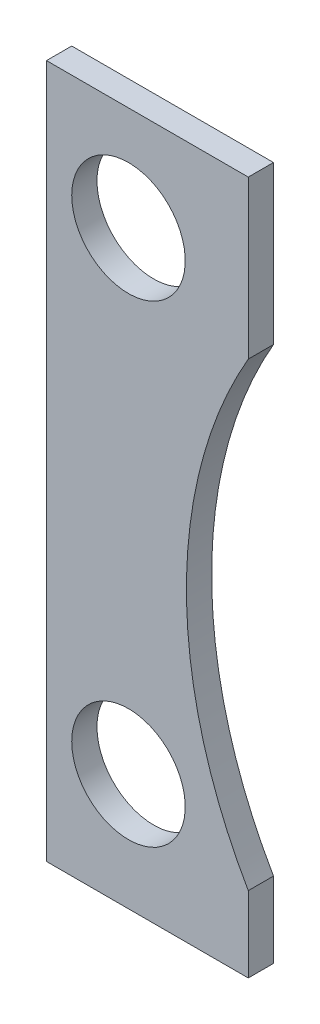
ISO-10303-21;
HEADER;
FILE_DESCRIPTION(('STEP AP214'),'2;1');
FILE_NAME('part.step','',(''),(''),'','','');
FILE_SCHEMA(('AUTOMOTIVE_DESIGN { 1 0 10303 214 1 1 1 1 }'));
ENDSEC;
DATA;
#1=APPLICATION_CONTEXT('core data for automotive mechanical design processes');
#2=APPLICATION_PROTOCOL_DEFINITION('international standard','automotive_design',2000,#1);
#3=PRODUCT_CONTEXT('',#1,'mechanical');
#4=PRODUCT('Part','Part','',(#3));
#5=PRODUCT_RELATED_PRODUCT_CATEGORY('part','',(#4));
#6=PRODUCT_DEFINITION_FORMATION('','',#4);
#7=PRODUCT_DEFINITION_CONTEXT('part definition',#1,'design');
#8=PRODUCT_DEFINITION('design','',#6,#7);
#9=PRODUCT_DEFINITION_SHAPE('','',#8);
#10=(LENGTH_UNIT() NAMED_UNIT(*) SI_UNIT(.MILLI.,.METRE.));
#11=(NAMED_UNIT(*) PLANE_ANGLE_UNIT() SI_UNIT($,.RADIAN.));
#12=(NAMED_UNIT(*) SI_UNIT($,.STERADIAN.) SOLID_ANGLE_UNIT());
#13=UNCERTAINTY_MEASURE_WITH_UNIT(LENGTH_MEASURE(1.E-05),#10,'distance_accuracy_value','');
#14=(GEOMETRIC_REPRESENTATION_CONTEXT(3) GLOBAL_UNCERTAINTY_ASSIGNED_CONTEXT((#13)) GLOBAL_UNIT_ASSIGNED_CONTEXT((#10,
#11,#12)) REPRESENTATION_CONTEXT('',''));
#15=CARTESIAN_POINT('',(0.,0.,0.));
#16=DIRECTION('',(0.,0.,1.));
#17=DIRECTION('',(1.,0.,0.));
#18=AXIS2_PLACEMENT_3D('',#15,#16,#17);
#19=CARTESIAN_POINT('',(0.,110.,2.));
#20=DIRECTION('',(1.,0.,0.));
#21=DIRECTION('',(0.,1.,0.));
#22=AXIS2_PLACEMENT_3D('',#19,#20,#21);
#23=PLANE('',#22);
#24=DIRECTION('',(0.,-1.,0.));
#25=VECTOR('',#24,1.);
#26=CARTESIAN_POINT('',(0.,110.,-2.));
#27=LINE('',#26,#25);
#28=CARTESIAN_POINT('',(0.,110.,-2.));
#29=VERTEX_POINT('',#28);
#30=CARTESIAN_POINT('',(0.,0.,-2.));
#31=VERTEX_POINT('',#30);
#32=EDGE_CURVE('E121',#29,#31,#27,.T.);
#33=ORIENTED_EDGE('',*,*,#32,.T.);
#34=DIRECTION('',(0.,0.,-1.));
#35=VECTOR('',#34,1.);
#36=CARTESIAN_POINT('',(0.,0.,2.));
#37=LINE('',#36,#35);
#38=CARTESIAN_POINT('',(0.,0.,2.));
#39=VERTEX_POINT('',#38);
#40=EDGE_CURVE('E11',#39,#31,#37,.T.);
#41=ORIENTED_EDGE('',*,*,#40,.F.);
#42=DIRECTION('',(0.,-1.,0.));
#43=VECTOR('',#42,1.);
#44=CARTESIAN_POINT('',(0.,110.,2.));
#45=LINE('',#44,#43);
#46=CARTESIAN_POINT('',(0.,110.,2.));
#47=VERTEX_POINT('',#46);
#48=EDGE_CURVE('E132',#47,#39,#45,.T.);
#49=ORIENTED_EDGE('',*,*,#48,.F.);
#50=DIRECTION('',(0.,0.,-1.));
#51=VECTOR('',#50,1.);
#52=CARTESIAN_POINT('',(0.,110.,2.));
#53=LINE('',#52,#51);
#54=EDGE_CURVE('E117',#47,#29,#53,.T.);
#55=ORIENTED_EDGE('',*,*,#54,.T.);
#56=EDGE_LOOP('',(#33,#41,#49,#55));
#57=FACE_BOUND('',#56,.T.);
#58=ADVANCED_FACE('F37',(#57),#23,.F.);
#59=CARTESIAN_POINT('',(0.,0.,2.));
#60=DIRECTION('',(0.,1.,0.));
#61=DIRECTION('',(0.,0.,1.));
#62=AXIS2_PLACEMENT_3D('',#59,#60,#61);
#63=PLANE('',#62);
#64=DIRECTION('',(1.,0.,0.));
#65=VECTOR('',#64,1.);
#66=CARTESIAN_POINT('',(0.,0.,-2.));
#67=LINE('',#66,#65);
#68=CARTESIAN_POINT('',(32.,0.,-2.));
#69=VERTEX_POINT('',#68);
#70=EDGE_CURVE('E124',#31,#69,#67,.T.);
#71=ORIENTED_EDGE('',*,*,#70,.T.);
#72=DIRECTION('',(0.,0.,-1.));
#73=VECTOR('',#72,1.);
#74=CARTESIAN_POINT('',(32.,0.,2.));
#75=LINE('',#74,#73);
#76=CARTESIAN_POINT('',(32.,0.,2.));
#77=VERTEX_POINT('',#76);
#78=EDGE_CURVE('E45',#77,#69,#75,.T.);
#79=ORIENTED_EDGE('',*,*,#78,.F.);
#80=DIRECTION('',(1.,0.,0.));
#81=VECTOR('',#80,1.);
#82=CARTESIAN_POINT('',(0.,0.,2.));
#83=LINE('',#82,#81);
#84=EDGE_CURVE('E90',#39,#77,#83,.T.);
#85=ORIENTED_EDGE('',*,*,#84,.F.);
#86=ORIENTED_EDGE('',*,*,#40,.T.);
#87=EDGE_LOOP('',(#71,#79,#85,#86));
#88=FACE_BOUND('',#87,.T.);
#89=ADVANCED_FACE('F157',(#88),#63,.F.);
#90=CARTESIAN_POINT('',(32.,12.,2.));
#91=DIRECTION('',(-1.,0.,0.));
#92=DIRECTION('',(0.,-1.,0.));
#93=AXIS2_PLACEMENT_3D('',#90,#91,#92);
#94=PLANE('',#93);
#95=DIRECTION('',(0.,1.,0.));
#96=VECTOR('',#95,1.);
#97=CARTESIAN_POINT('',(32.,12.,-2.));
#98=LINE('',#97,#96);
#99=CARTESIAN_POINT('',(32.,12.,-2.));
#100=VERTEX_POINT('',#99);
#101=EDGE_CURVE('E127',#69,#100,#98,.T.);
#102=ORIENTED_EDGE('',*,*,#101,.T.);
#103=DIRECTION('',(0.,0.,-1.));
#104=VECTOR('',#103,1.);
#105=CARTESIAN_POINT('',(32.,12.,2.));
#106=LINE('',#105,#104);
#107=CARTESIAN_POINT('',(32.,12.,2.));
#108=VERTEX_POINT('',#107);
#109=EDGE_CURVE('E112',#108,#100,#106,.T.);
#110=ORIENTED_EDGE('',*,*,#109,.F.);
#111=DIRECTION('',(0.,1.,0.));
#112=VECTOR('',#111,1.);
#113=CARTESIAN_POINT('',(32.,12.,2.));
#114=LINE('',#113,#112);
#115=EDGE_CURVE('E103',#77,#108,#114,.T.);
#116=ORIENTED_EDGE('',*,*,#115,.F.);
#117=ORIENTED_EDGE('',*,*,#78,.T.);
#118=EDGE_LOOP('',(#102,#110,#116,#117));
#119=FACE_BOUND('',#118,.T.);
#120=ADVANCED_FACE('F138',(#119),#94,.F.);
#121=CARTESIAN_POINT('',(95.000000000003,48.5,2.));
#122=DIRECTION('',(0.,0.,-1.));
#123=DIRECTION('',(-1.,0.,0.));
#124=AXIS2_PLACEMENT_3D('',#121,#122,#123);
#125=CYLINDRICAL_SURFACE('',#124,72.8096834219211);
#126=CARTESIAN_POINT('',(95.000000000003,48.5,-2.));
#127=DIRECTION('',(0.,0.,-1.));
#128=DIRECTION('',(1.,0.,0.));
#129=AXIS2_PLACEMENT_3D('',#126,#127,#128);
#130=CIRCLE('',#129,72.8096834219211);
#131=CARTESIAN_POINT('',(32.,85.,-2.));
#132=VERTEX_POINT('',#131);
#133=EDGE_CURVE('E111',#100,#132,#130,.T.);
#134=ORIENTED_EDGE('',*,*,#133,.T.);
#135=DIRECTION('',(0.,0.,-1.));
#136=VECTOR('',#135,1.);
#137=CARTESIAN_POINT('',(32.,85.,2.));
#138=LINE('',#137,#136);
#139=CARTESIAN_POINT('',(32.,85.,2.));
#140=VERTEX_POINT('',#139);
#141=EDGE_CURVE('E108',#140,#132,#138,.T.);
#142=ORIENTED_EDGE('',*,*,#141,.F.);
#143=CARTESIAN_POINT('',(95.000000000003,48.5,2.));
#144=DIRECTION('',(0.,0.,-1.));
#145=DIRECTION('',(1.,0.,0.));
#146=AXIS2_PLACEMENT_3D('',#143,#144,#145);
#147=CIRCLE('',#146,72.8096834219211);
#148=EDGE_CURVE('E97',#108,#140,#147,.T.);
#149=ORIENTED_EDGE('',*,*,#148,.F.);
#150=ORIENTED_EDGE('',*,*,#109,.T.);
#151=EDGE_LOOP('',(#134,#142,#149,#150));
#152=FACE_BOUND('',#151,.T.);
#153=ADVANCED_FACE('F109',(#152),#125,.F.);
#154=CARTESIAN_POINT('',(32.,110.,2.));
#155=DIRECTION('',(-1.,0.,0.));
#156=DIRECTION('',(0.,-1.,0.));
#157=AXIS2_PLACEMENT_3D('',#154,#155,#156);
#158=PLANE('',#157);
#159=DIRECTION('',(0.,1.,0.));
#160=VECTOR('',#159,1.);
#161=CARTESIAN_POINT('',(32.,110.,-2.));
#162=LINE('',#161,#160);
#163=CARTESIAN_POINT('',(32.,110.,-2.));
#164=VERTEX_POINT('',#163);
#165=EDGE_CURVE('E76',#132,#164,#162,.T.);
#166=ORIENTED_EDGE('',*,*,#165,.T.);
#167=DIRECTION('',(0.,0.,-1.));
#168=VECTOR('',#167,1.);
#169=CARTESIAN_POINT('',(32.,110.,2.));
#170=LINE('',#169,#168);
#171=CARTESIAN_POINT('',(32.,110.,2.));
#172=VERTEX_POINT('',#171);
#173=EDGE_CURVE('E113',#172,#164,#170,.T.);
#174=ORIENTED_EDGE('',*,*,#173,.F.);
#175=DIRECTION('',(0.,1.,0.));
#176=VECTOR('',#175,1.);
#177=CARTESIAN_POINT('',(32.,110.,2.));
#178=LINE('',#177,#176);
#179=EDGE_CURVE('E101',#140,#172,#178,.T.);
#180=ORIENTED_EDGE('',*,*,#179,.F.);
#181=ORIENTED_EDGE('',*,*,#141,.T.);
#182=EDGE_LOOP('',(#166,#174,#180,#181));
#183=FACE_BOUND('',#182,.T.);
#184=ADVANCED_FACE('F115',(#183),#158,.F.);
#185=CARTESIAN_POINT('',(0.,110.,2.));
#186=DIRECTION('',(0.,-1.,0.));
#187=DIRECTION('',(0.,0.,-1.));
#188=AXIS2_PLACEMENT_3D('',#185,#186,#187);
#189=PLANE('',#188);
#190=DIRECTION('',(-1.,0.,0.));
#191=VECTOR('',#190,1.);
#192=CARTESIAN_POINT('',(0.,110.,-2.));
#193=LINE('',#192,#191);
#194=EDGE_CURVE('E82',#164,#29,#193,.T.);
#195=ORIENTED_EDGE('',*,*,#194,.T.);
#196=ORIENTED_EDGE('',*,*,#54,.F.);
#197=DIRECTION('',(-1.,0.,0.));
#198=VECTOR('',#197,1.);
#199=CARTESIAN_POINT('',(0.,110.,2.));
#200=LINE('',#199,#198);
#201=EDGE_CURVE('E53',#172,#47,#200,.T.);
#202=ORIENTED_EDGE('',*,*,#201,.F.);
#203=ORIENTED_EDGE('',*,*,#173,.T.);
#204=EDGE_LOOP('',(#195,#196,#202,#203));
#205=FACE_BOUND('',#204,.T.);
#206=ADVANCED_FACE('F145',(#205),#189,.F.);
#207=CARTESIAN_POINT('',(95.000000000003,48.5,2.));
#208=DIRECTION('',(0.,0.,1.));
#209=DIRECTION('',(1.,0.,0.));
#210=AXIS2_PLACEMENT_3D('',#207,#208,#209);
#211=PLANE('',#210);
#212=CARTESIAN_POINT('',(13.000000000003,93.4999999999999,2.));
#213=DIRECTION('',(0.,0.,-1.));
#214=DIRECTION('',(-1.,0.,0.));
#215=AXIS2_PLACEMENT_3D('',#212,#213,#214);
#216=CIRCLE('',#215,9.00000000000002);
#217=CARTESIAN_POINT('',(4.000000000003,93.4999999999999,2.));
#218=VERTEX_POINT('',#217);
#219=EDGE_CURVE('E125',#218,#218,#216,.T.);
#220=ORIENTED_EDGE('',*,*,#219,.T.);
#221=EDGE_LOOP('',(#220));
#222=FACE_BOUND('',#221,.T.);
#223=CARTESIAN_POINT('',(13.000000000003,18.4999999999999,2.));
#224=DIRECTION('',(0.,0.,-1.));
#225=DIRECTION('',(-1.,0.,0.));
#226=AXIS2_PLACEMENT_3D('',#223,#224,#225);
#227=CIRCLE('',#226,9.);
#228=CARTESIAN_POINT('',(4.00000000000302,18.4999999999999,2.));
#229=VERTEX_POINT('',#228);
#230=EDGE_CURVE('E223',#229,#229,#227,.T.);
#231=ORIENTED_EDGE('',*,*,#230,.T.);
#232=EDGE_LOOP('',(#231));
#233=FACE_BOUND('',#232,.T.);
#234=ORIENTED_EDGE('',*,*,#48,.T.);
#235=ORIENTED_EDGE('',*,*,#84,.T.);
#236=ORIENTED_EDGE('',*,*,#115,.T.);
#237=ORIENTED_EDGE('',*,*,#148,.T.);
#238=ORIENTED_EDGE('',*,*,#179,.T.);
#239=ORIENTED_EDGE('',*,*,#201,.T.);
#240=EDGE_LOOP('',(#234,#235,#236,#237,#238,#239));
#241=FACE_BOUND('',#240,.T.);
#242=ADVANCED_FACE('F99',(#222,#233,#241),#211,.T.);
#243=CARTESIAN_POINT('',(95.000000000003,48.5,-2.));
#244=DIRECTION('',(0.,0.,1.));
#245=DIRECTION('',(1.,0.,0.));
#246=AXIS2_PLACEMENT_3D('',#243,#244,#245);
#247=PLANE('',#246);
#248=CARTESIAN_POINT('',(13.000000000003,93.4999999999999,-2.));
#249=DIRECTION('',(0.,0.,-1.));
#250=DIRECTION('',(-1.,0.,0.));
#251=AXIS2_PLACEMENT_3D('',#248,#249,#250);
#252=CIRCLE('',#251,9.00000000000002);
#253=CARTESIAN_POINT('',(4.000000000003,93.4999999999999,-2.));
#254=VERTEX_POINT('',#253);
#255=EDGE_CURVE('E222',#254,#254,#252,.T.);
#256=ORIENTED_EDGE('',*,*,#255,.F.);
#257=EDGE_LOOP('',(#256));
#258=FACE_BOUND('',#257,.T.);
#259=CARTESIAN_POINT('',(13.000000000003,18.4999999999999,-2.));
#260=DIRECTION('',(0.,0.,-1.));
#261=DIRECTION('',(-1.,0.,0.));
#262=AXIS2_PLACEMENT_3D('',#259,#260,#261);
#263=CIRCLE('',#262,9.);
#264=CARTESIAN_POINT('',(4.00000000000302,18.4999999999999,-2.));
#265=VERTEX_POINT('',#264);
#266=EDGE_CURVE('E227',#265,#265,#263,.T.);
#267=ORIENTED_EDGE('',*,*,#266,.F.);
#268=EDGE_LOOP('',(#267));
#269=FACE_BOUND('',#268,.T.);
#270=ORIENTED_EDGE('',*,*,#32,.F.);
#271=ORIENTED_EDGE('',*,*,#194,.F.);
#272=ORIENTED_EDGE('',*,*,#165,.F.);
#273=ORIENTED_EDGE('',*,*,#133,.F.);
#274=ORIENTED_EDGE('',*,*,#101,.F.);
#275=ORIENTED_EDGE('',*,*,#70,.F.);
#276=EDGE_LOOP('',(#270,#271,#272,#273,#274,#275));
#277=FACE_BOUND('',#276,.T.);
#278=ADVANCED_FACE('F141',(#258,#269,#277),#247,.F.);
#279=CARTESIAN_POINT('',(13.000000000003,18.4999999999999,2.));
#280=DIRECTION('',(0.,0.,-1.));
#281=DIRECTION('',(-1.,0.,0.));
#282=AXIS2_PLACEMENT_3D('',#279,#280,#281);
#283=CYLINDRICAL_SURFACE('',#282,9.);
#284=ORIENTED_EDGE('',*,*,#230,.F.);
#285=EDGE_LOOP('',(#284));
#286=FACE_BOUND('',#285,.T.);
#287=ORIENTED_EDGE('',*,*,#266,.T.);
#288=EDGE_LOOP('',(#287));
#289=FACE_BOUND('',#288,.T.);
#290=ADVANCED_FACE('F194',(#286,#289),#283,.F.);
#291=CARTESIAN_POINT('',(13.000000000003,93.4999999999999,2.));
#292=DIRECTION('',(0.,0.,-1.));
#293=DIRECTION('',(-1.,0.,0.));
#294=AXIS2_PLACEMENT_3D('',#291,#292,#293);
#295=CYLINDRICAL_SURFACE('',#294,9.00000000000002);
#296=ORIENTED_EDGE('',*,*,#219,.F.);
#297=EDGE_LOOP('',(#296));
#298=FACE_BOUND('',#297,.T.);
#299=ORIENTED_EDGE('',*,*,#255,.T.);
#300=EDGE_LOOP('',(#299));
#301=FACE_BOUND('',#300,.T.);
#302=ADVANCED_FACE('F203',(#298,#301),#295,.F.);
#303=CLOSED_SHELL('',(#58,#89,#120,#153,#184,#206,#242,#278,#290,#302));
#304=MANIFOLD_SOLID_BREP('B2',#303);
#305=ADVANCED_BREP_SHAPE_REPRESENTATION('',(#18,#304),#14);
#306=SHAPE_DEFINITION_REPRESENTATION(#9,#305);
ENDSEC;
END-ISO-10303-21;
